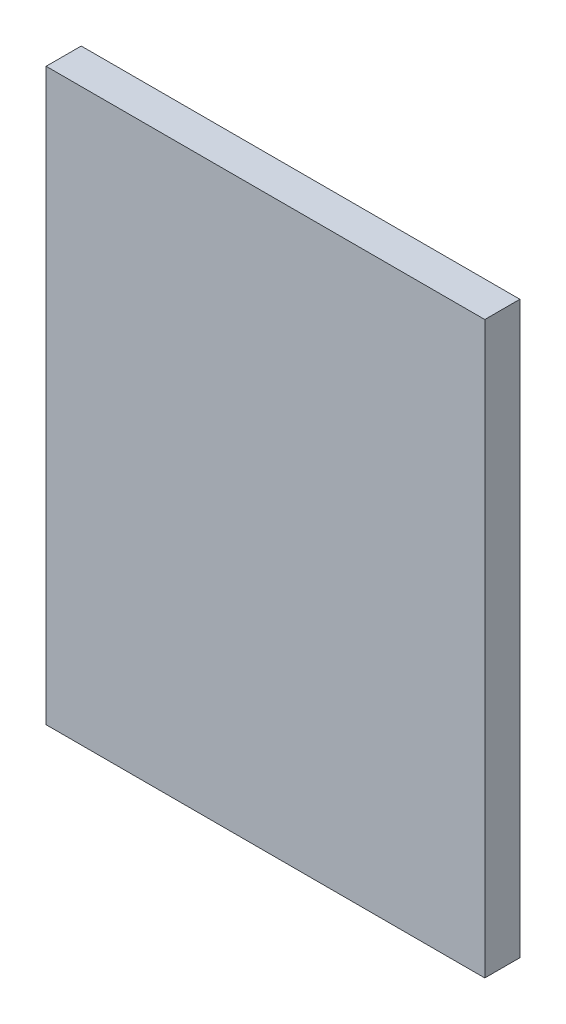
ISO-10303-21;
HEADER;
FILE_DESCRIPTION(('STEP AP214'),'2;1');
FILE_NAME('part.step','',(''),(''),'','','');
FILE_SCHEMA(('AUTOMOTIVE_DESIGN { 1 0 10303 214 1 1 1 1 }'));
ENDSEC;
DATA;
#1=APPLICATION_CONTEXT('core data for automotive mechanical design processes');
#2=APPLICATION_PROTOCOL_DEFINITION('international standard','automotive_design',2000,#1);
#3=PRODUCT_CONTEXT('',#1,'mechanical');
#4=PRODUCT('Part','Part','',(#3));
#5=PRODUCT_RELATED_PRODUCT_CATEGORY('part','',(#4));
#6=PRODUCT_DEFINITION_FORMATION('','',#4);
#7=PRODUCT_DEFINITION_CONTEXT('part definition',#1,'design');
#8=PRODUCT_DEFINITION('design','',#6,#7);
#9=PRODUCT_DEFINITION_SHAPE('','',#8);
#10=(LENGTH_UNIT() NAMED_UNIT(*) SI_UNIT(.MILLI.,.METRE.));
#11=(NAMED_UNIT(*) PLANE_ANGLE_UNIT() SI_UNIT($,.RADIAN.));
#12=(NAMED_UNIT(*) SI_UNIT($,.STERADIAN.) SOLID_ANGLE_UNIT());
#13=UNCERTAINTY_MEASURE_WITH_UNIT(LENGTH_MEASURE(1.E-05),#10,'distance_accuracy_value','');
#14=(GEOMETRIC_REPRESENTATION_CONTEXT(3) GLOBAL_UNCERTAINTY_ASSIGNED_CONTEXT((#13)) GLOBAL_UNIT_ASSIGNED_CONTEXT((#10,
#11,#12)) REPRESENTATION_CONTEXT('',''));
#15=CARTESIAN_POINT('',(0.,0.,0.));
#16=DIRECTION('',(0.,0.,1.));
#17=DIRECTION('',(1.,0.,0.));
#18=AXIS2_PLACEMENT_3D('',#15,#16,#17);
#19=CARTESIAN_POINT('',(0.,0.,8.));
#20=DIRECTION('',(1.,0.,0.));
#21=DIRECTION('',(0.,1.,0.));
#22=AXIS2_PLACEMENT_3D('',#19,#20,#21);
#23=PLANE('',#22);
#24=DIRECTION('',(0.,-1.,0.));
#25=VECTOR('',#24,1.);
#26=CARTESIAN_POINT('',(0.,0.,0.));
#27=LINE('',#26,#25);
#28=CARTESIAN_POINT('',(0.,130.,0.));
#29=VERTEX_POINT('',#28);
#30=CARTESIAN_POINT('',(0.,0.,0.));
#31=VERTEX_POINT('',#30);
#32=EDGE_CURVE('E95',#29,#31,#27,.T.);
#33=ORIENTED_EDGE('',*,*,#32,.T.);
#34=DIRECTION('',(0.,0.,-1.));
#35=VECTOR('',#34,1.);
#36=CARTESIAN_POINT('',(0.,0.,8.));
#37=LINE('',#36,#35);
#38=CARTESIAN_POINT('',(0.,0.,8.));
#39=VERTEX_POINT('',#38);
#40=EDGE_CURVE('E11',#39,#31,#37,.T.);
#41=ORIENTED_EDGE('',*,*,#40,.F.);
#42=DIRECTION('',(0.,-1.,0.));
#43=VECTOR('',#42,1.);
#44=CARTESIAN_POINT('',(0.,0.,8.));
#45=LINE('',#44,#43);
#46=CARTESIAN_POINT('',(0.,130.,8.));
#47=VERTEX_POINT('',#46);
#48=EDGE_CURVE('E83',#47,#39,#45,.T.);
#49=ORIENTED_EDGE('',*,*,#48,.F.);
#50=DIRECTION('',(0.,0.,-1.));
#51=VECTOR('',#50,1.);
#52=CARTESIAN_POINT('',(0.,130.,8.));
#53=LINE('',#52,#51);
#54=EDGE_CURVE('E91',#47,#29,#53,.T.);
#55=ORIENTED_EDGE('',*,*,#54,.T.);
#56=EDGE_LOOP('',(#33,#41,#49,#55));
#57=FACE_BOUND('',#56,.T.);
#58=ADVANCED_FACE('F32',(#57),#23,.F.);
#59=CARTESIAN_POINT('',(0.,0.,8.));
#60=DIRECTION('',(0.,1.,0.));
#61=DIRECTION('',(0.,0.,1.));
#62=AXIS2_PLACEMENT_3D('',#59,#60,#61);
#63=PLANE('',#62);
#64=DIRECTION('',(1.,0.,0.));
#65=VECTOR('',#64,1.);
#66=CARTESIAN_POINT('',(0.,0.,0.));
#67=LINE('',#66,#65);
#68=CARTESIAN_POINT('',(100.,0.,0.));
#69=VERTEX_POINT('',#68);
#70=EDGE_CURVE('E87',#31,#69,#67,.T.);
#71=ORIENTED_EDGE('',*,*,#70,.T.);
#72=DIRECTION('',(0.,0.,-1.));
#73=VECTOR('',#72,1.);
#74=CARTESIAN_POINT('',(100.,0.,8.));
#75=LINE('',#74,#73);
#76=CARTESIAN_POINT('',(100.,0.,8.));
#77=VERTEX_POINT('',#76);
#78=EDGE_CURVE('E40',#77,#69,#75,.T.);
#79=ORIENTED_EDGE('',*,*,#78,.F.);
#80=DIRECTION('',(1.,0.,0.));
#81=VECTOR('',#80,1.);
#82=CARTESIAN_POINT('',(0.,0.,8.));
#83=LINE('',#82,#81);
#84=EDGE_CURVE('E78',#39,#77,#83,.T.);
#85=ORIENTED_EDGE('',*,*,#84,.F.);
#86=ORIENTED_EDGE('',*,*,#40,.T.);
#87=EDGE_LOOP('',(#71,#79,#85,#86));
#88=FACE_BOUND('',#87,.T.);
#89=ADVANCED_FACE('F86',(#88),#63,.F.);
#90=CARTESIAN_POINT('',(100.,0.,8.));
#91=DIRECTION('',(-1.,0.,0.));
#92=DIRECTION('',(0.,-1.,0.));
#93=AXIS2_PLACEMENT_3D('',#90,#91,#92);
#94=PLANE('',#93);
#95=DIRECTION('',(0.,1.,0.));
#96=VECTOR('',#95,1.);
#97=CARTESIAN_POINT('',(100.,0.,0.));
#98=LINE('',#97,#96);
#99=CARTESIAN_POINT('',(100.,130.,0.));
#100=VERTEX_POINT('',#99);
#101=EDGE_CURVE('E65',#69,#100,#98,.T.);
#102=ORIENTED_EDGE('',*,*,#101,.T.);
#103=DIRECTION('',(0.,0.,-1.));
#104=VECTOR('',#103,1.);
#105=CARTESIAN_POINT('',(100.,130.,8.));
#106=LINE('',#105,#104);
#107=CARTESIAN_POINT('',(100.,130.,8.));
#108=VERTEX_POINT('',#107);
#109=EDGE_CURVE('E88',#108,#100,#106,.T.);
#110=ORIENTED_EDGE('',*,*,#109,.F.);
#111=DIRECTION('',(0.,1.,0.));
#112=VECTOR('',#111,1.);
#113=CARTESIAN_POINT('',(100.,0.,8.));
#114=LINE('',#113,#112);
#115=EDGE_CURVE('E81',#77,#108,#114,.T.);
#116=ORIENTED_EDGE('',*,*,#115,.F.);
#117=ORIENTED_EDGE('',*,*,#78,.T.);
#118=EDGE_LOOP('',(#102,#110,#116,#117));
#119=FACE_BOUND('',#118,.T.);
#120=ADVANCED_FACE('F89',(#119),#94,.F.);
#121=CARTESIAN_POINT('',(0.,130.,8.));
#122=DIRECTION('',(0.,-1.,0.));
#123=DIRECTION('',(0.,0.,-1.));
#124=AXIS2_PLACEMENT_3D('',#121,#122,#123);
#125=PLANE('',#124);
#126=DIRECTION('',(-1.,0.,0.));
#127=VECTOR('',#126,1.);
#128=CARTESIAN_POINT('',(0.,130.,0.));
#129=LINE('',#128,#127);
#130=EDGE_CURVE('E71',#100,#29,#129,.T.);
#131=ORIENTED_EDGE('',*,*,#130,.T.);
#132=ORIENTED_EDGE('',*,*,#54,.F.);
#133=DIRECTION('',(-1.,0.,0.));
#134=VECTOR('',#133,1.);
#135=CARTESIAN_POINT('',(0.,130.,8.));
#136=LINE('',#135,#134);
#137=EDGE_CURVE('E48',#108,#47,#136,.T.);
#138=ORIENTED_EDGE('',*,*,#137,.F.);
#139=ORIENTED_EDGE('',*,*,#109,.T.);
#140=EDGE_LOOP('',(#131,#132,#138,#139));
#141=FACE_BOUND('',#140,.T.);
#142=ADVANCED_FACE('F102',(#141),#125,.F.);
#143=CARTESIAN_POINT('',(0.,0.,8.));
#144=DIRECTION('',(0.,0.,-1.));
#145=DIRECTION('',(-1.,0.,0.));
#146=AXIS2_PLACEMENT_3D('',#143,#144,#145);
#147=PLANE('',#146);
#148=ORIENTED_EDGE('',*,*,#48,.T.);
#149=ORIENTED_EDGE('',*,*,#84,.T.);
#150=ORIENTED_EDGE('',*,*,#115,.T.);
#151=ORIENTED_EDGE('',*,*,#137,.T.);
#152=EDGE_LOOP('',(#148,#149,#150,#151));
#153=FACE_BOUND('',#152,.T.);
#154=ADVANCED_FACE('F79',(#153),#147,.F.);
#155=CARTESIAN_POINT('',(0.,0.,0.));
#156=DIRECTION('',(0.,0.,-1.));
#157=DIRECTION('',(-1.,0.,0.));
#158=AXIS2_PLACEMENT_3D('',#155,#156,#157);
#159=PLANE('',#158);
#160=ORIENTED_EDGE('',*,*,#32,.F.);
#161=ORIENTED_EDGE('',*,*,#130,.F.);
#162=ORIENTED_EDGE('',*,*,#101,.F.);
#163=ORIENTED_EDGE('',*,*,#70,.F.);
#164=EDGE_LOOP('',(#160,#161,#162,#163));
#165=FACE_BOUND('',#164,.T.);
#166=ADVANCED_FACE('F105',(#165),#159,.T.);
#167=CLOSED_SHELL('',(#58,#89,#120,#142,#154,#166));
#168=MANIFOLD_SOLID_BREP('B2',#167);
#169=ADVANCED_BREP_SHAPE_REPRESENTATION('',(#18,#168),#14);
#170=SHAPE_DEFINITION_REPRESENTATION(#9,#169);
ENDSEC;
END-ISO-10303-21;
